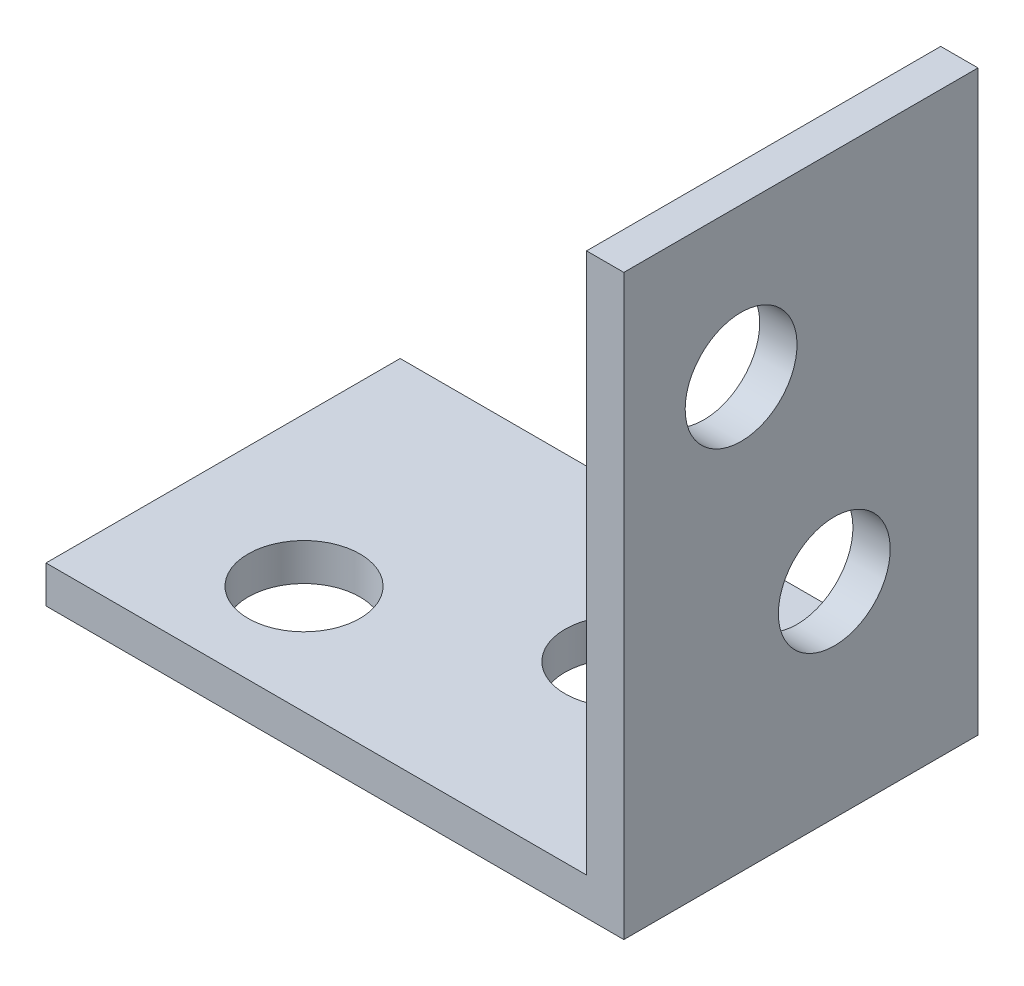
ISO-10303-21;
HEADER;
FILE_DESCRIPTION(('STEP AP214'),'2;1');
FILE_NAME('part.step','',(''),(''),'','','');
FILE_SCHEMA(('AUTOMOTIVE_DESIGN { 1 0 10303 214 1 1 1 1 }'));
ENDSEC;
DATA;
#1=APPLICATION_CONTEXT('core data for automotive mechanical design processes');
#2=APPLICATION_PROTOCOL_DEFINITION('international standard','automotive_design',2000,#1);
#3=PRODUCT_CONTEXT('',#1,'mechanical');
#4=PRODUCT('Part','Part','',(#3));
#5=PRODUCT_RELATED_PRODUCT_CATEGORY('part','',(#4));
#6=PRODUCT_DEFINITION_FORMATION('','',#4);
#7=PRODUCT_DEFINITION_CONTEXT('part definition',#1,'design');
#8=PRODUCT_DEFINITION('design','',#6,#7);
#9=PRODUCT_DEFINITION_SHAPE('','',#8);
#10=(LENGTH_UNIT() NAMED_UNIT(*) SI_UNIT(.MILLI.,.METRE.));
#11=(NAMED_UNIT(*) PLANE_ANGLE_UNIT() SI_UNIT($,.RADIAN.));
#12=(NAMED_UNIT(*) SI_UNIT($,.STERADIAN.) SOLID_ANGLE_UNIT());
#13=UNCERTAINTY_MEASURE_WITH_UNIT(LENGTH_MEASURE(1.E-05),#10,'distance_accuracy_value','');
#14=(GEOMETRIC_REPRESENTATION_CONTEXT(3) GLOBAL_UNCERTAINTY_ASSIGNED_CONTEXT((#13)) GLOBAL_UNIT_ASSIGNED_CONTEXT((#10,
#11,#12)) REPRESENTATION_CONTEXT('',''));
#15=CARTESIAN_POINT('',(0.,0.,0.));
#16=DIRECTION('',(0.,0.,1.));
#17=DIRECTION('',(1.,0.,0.));
#18=AXIS2_PLACEMENT_3D('',#15,#16,#17);
#19=CARTESIAN_POINT('',(0.,2.,19.));
#20=DIRECTION('',(1.,0.,0.));
#21=DIRECTION('',(0.,1.,0.));
#22=AXIS2_PLACEMENT_3D('',#19,#20,#21);
#23=PLANE('',#22);
#24=DIRECTION('',(0.,-1.,0.));
#25=VECTOR('',#24,1.);
#26=CARTESIAN_POINT('',(0.,2.,0.));
#27=LINE('',#26,#25);
#28=CARTESIAN_POINT('',(0.,2.,0.));
#29=VERTEX_POINT('',#28);
#30=CARTESIAN_POINT('',(0.,0.,0.));
#31=VERTEX_POINT('',#30);
#32=EDGE_CURVE('E125',#29,#31,#27,.T.);
#33=ORIENTED_EDGE('',*,*,#32,.T.);
#34=DIRECTION('',(0.,0.,-1.));
#35=VECTOR('',#34,1.);
#36=CARTESIAN_POINT('',(0.,0.,19.));
#37=LINE('',#36,#35);
#38=CARTESIAN_POINT('',(0.,0.,19.));
#39=VERTEX_POINT('',#38);
#40=EDGE_CURVE('E11',#39,#31,#37,.T.);
#41=ORIENTED_EDGE('',*,*,#40,.F.);
#42=DIRECTION('',(0.,-1.,0.));
#43=VECTOR('',#42,1.);
#44=CARTESIAN_POINT('',(0.,2.,19.));
#45=LINE('',#44,#43);
#46=CARTESIAN_POINT('',(0.,2.,19.));
#47=VERTEX_POINT('',#46);
#48=EDGE_CURVE('E136',#47,#39,#45,.T.);
#49=ORIENTED_EDGE('',*,*,#48,.F.);
#50=DIRECTION('',(0.,0.,-1.));
#51=VECTOR('',#50,1.);
#52=CARTESIAN_POINT('',(0.,2.,19.));
#53=LINE('',#52,#51);
#54=EDGE_CURVE('E121',#47,#29,#53,.T.);
#55=ORIENTED_EDGE('',*,*,#54,.T.);
#56=EDGE_LOOP('',(#33,#41,#49,#55));
#57=FACE_BOUND('',#56,.T.);
#58=ADVANCED_FACE('F41',(#57),#23,.F.);
#59=CARTESIAN_POINT('',(0.,0.,19.));
#60=DIRECTION('',(0.,1.,0.));
#61=DIRECTION('',(0.,0.,1.));
#62=AXIS2_PLACEMENT_3D('',#59,#60,#61);
#63=PLANE('',#62);
#64=CARTESIAN_POINT('',(20.,0.,8.15685710092901));
#65=DIRECTION('',(0.,1.,0.));
#66=DIRECTION('',(0.,0.,1.));
#67=AXIS2_PLACEMENT_3D('',#64,#65,#66);
#68=CIRCLE('',#67,3.);
#69=CARTESIAN_POINT('',(20.,0.,11.156857100929));
#70=VERTEX_POINT('',#69);
#71=EDGE_CURVE('E247',#70,#70,#68,.T.);
#72=ORIENTED_EDGE('',*,*,#71,.T.);
#73=EDGE_LOOP('',(#72));
#74=FACE_BOUND('',#73,.T.);
#75=CARTESIAN_POINT('',(8.,0.,13.156857100929));
#76=DIRECTION('',(0.,1.,0.));
#77=DIRECTION('',(0.,0.,1.));
#78=AXIS2_PLACEMENT_3D('',#75,#76,#77);
#79=CIRCLE('',#78,3.);
#80=CARTESIAN_POINT('',(8.,0.,16.156857100929));
#81=VERTEX_POINT('',#80);
#82=EDGE_CURVE('E249',#81,#81,#79,.T.);
#83=ORIENTED_EDGE('',*,*,#82,.T.);
#84=EDGE_LOOP('',(#83));
#85=FACE_BOUND('',#84,.T.);
#86=DIRECTION('',(1.,0.,0.));
#87=VECTOR('',#86,1.);
#88=CARTESIAN_POINT('',(0.,0.,0.));
#89=LINE('',#88,#87);
#90=CARTESIAN_POINT('',(31.,0.,0.));
#91=VERTEX_POINT('',#90);
#92=EDGE_CURVE('E128',#31,#91,#89,.T.);
#93=ORIENTED_EDGE('',*,*,#92,.T.);
#94=DIRECTION('',(0.,0.,-1.));
#95=VECTOR('',#94,1.);
#96=CARTESIAN_POINT('',(31.,0.,19.));
#97=LINE('',#96,#95);
#98=CARTESIAN_POINT('',(31.,0.,19.));
#99=VERTEX_POINT('',#98);
#100=EDGE_CURVE('E49',#99,#91,#97,.T.);
#101=ORIENTED_EDGE('',*,*,#100,.F.);
#102=DIRECTION('',(1.,0.,0.));
#103=VECTOR('',#102,1.);
#104=CARTESIAN_POINT('',(0.,0.,19.));
#105=LINE('',#104,#103);
#106=EDGE_CURVE('E94',#39,#99,#105,.T.);
#107=ORIENTED_EDGE('',*,*,#106,.F.);
#108=ORIENTED_EDGE('',*,*,#40,.T.);
#109=EDGE_LOOP('',(#93,#101,#107,#108));
#110=FACE_BOUND('',#109,.T.);
#111=ADVANCED_FACE('F166',(#74,#85,#110),#63,.F.);
#112=CARTESIAN_POINT('',(31.,0.,19.));
#113=DIRECTION('',(-1.,0.,0.));
#114=DIRECTION('',(0.,0.,1.));
#115=AXIS2_PLACEMENT_3D('',#112,#113,#114);
#116=PLANE('',#115);
#117=CARTESIAN_POINT('',(31.,11.,7.7098383528405));
#118=DIRECTION('',(-1.,0.,0.));
#119=DIRECTION('',(0.,0.,1.));
#120=AXIS2_PLACEMENT_3D('',#117,#118,#119);
#121=CIRCLE('',#120,3.);
#122=CARTESIAN_POINT('',(31.,11.,10.7098383528405));
#123=VERTEX_POINT('',#122);
#124=EDGE_CURVE('E129',#123,#123,#121,.T.);
#125=ORIENTED_EDGE('',*,*,#124,.T.);
#126=EDGE_LOOP('',(#125));
#127=FACE_BOUND('',#126,.T.);
#128=CARTESIAN_POINT('',(31.,23.,12.7098383528405));
#129=DIRECTION('',(-1.,0.,0.));
#130=DIRECTION('',(0.,0.,1.));
#131=AXIS2_PLACEMENT_3D('',#128,#129,#130);
#132=CIRCLE('',#131,3.);
#133=CARTESIAN_POINT('',(31.,23.,15.7098383528405));
#134=VERTEX_POINT('',#133);
#135=EDGE_CURVE('E259',#134,#134,#132,.T.);
#136=ORIENTED_EDGE('',*,*,#135,.T.);
#137=EDGE_LOOP('',(#136));
#138=FACE_BOUND('',#137,.T.);
#139=DIRECTION('',(0.,1.,0.));
#140=VECTOR('',#139,1.);
#141=CARTESIAN_POINT('',(31.,0.,0.));
#142=LINE('',#141,#140);
#143=CARTESIAN_POINT('',(31.,31.,0.));
#144=VERTEX_POINT('',#143);
#145=EDGE_CURVE('E131',#91,#144,#142,.T.);
#146=ORIENTED_EDGE('',*,*,#145,.T.);
#147=DIRECTION('',(0.,0.,-1.));
#148=VECTOR('',#147,1.);
#149=CARTESIAN_POINT('',(31.,31.,19.));
#150=LINE('',#149,#148);
#151=CARTESIAN_POINT('',(31.,31.,19.));
#152=VERTEX_POINT('',#151);
#153=EDGE_CURVE('E116',#152,#144,#150,.T.);
#154=ORIENTED_EDGE('',*,*,#153,.F.);
#155=DIRECTION('',(0.,1.,0.));
#156=VECTOR('',#155,1.);
#157=CARTESIAN_POINT('',(31.,0.,19.));
#158=LINE('',#157,#156);
#159=EDGE_CURVE('E107',#99,#152,#158,.T.);
#160=ORIENTED_EDGE('',*,*,#159,.F.);
#161=ORIENTED_EDGE('',*,*,#100,.T.);
#162=EDGE_LOOP('',(#146,#154,#160,#161));
#163=FACE_BOUND('',#162,.T.);
#164=ADVANCED_FACE('F142',(#127,#138,#163),#116,.F.);
#165=CARTESIAN_POINT('',(31.,31.,19.));
#166=DIRECTION('',(0.,-1.,0.));
#167=DIRECTION('',(0.,0.,-1.));
#168=AXIS2_PLACEMENT_3D('',#165,#166,#167);
#169=PLANE('',#168);
#170=DIRECTION('',(-1.,0.,0.));
#171=VECTOR('',#170,1.);
#172=CARTESIAN_POINT('',(31.,31.,0.));
#173=LINE('',#172,#171);
#174=CARTESIAN_POINT('',(29.,31.,0.));
#175=VERTEX_POINT('',#174);
#176=EDGE_CURVE('E115',#144,#175,#173,.T.);
#177=ORIENTED_EDGE('',*,*,#176,.T.);
#178=DIRECTION('',(0.,0.,-1.));
#179=VECTOR('',#178,1.);
#180=CARTESIAN_POINT('',(29.,31.,19.));
#181=LINE('',#180,#179);
#182=CARTESIAN_POINT('',(29.,31.,19.));
#183=VERTEX_POINT('',#182);
#184=EDGE_CURVE('E112',#183,#175,#181,.T.);
#185=ORIENTED_EDGE('',*,*,#184,.F.);
#186=DIRECTION('',(-1.,0.,0.));
#187=VECTOR('',#186,1.);
#188=CARTESIAN_POINT('',(31.,31.,19.));
#189=LINE('',#188,#187);
#190=EDGE_CURVE('E101',#152,#183,#189,.T.);
#191=ORIENTED_EDGE('',*,*,#190,.F.);
#192=ORIENTED_EDGE('',*,*,#153,.T.);
#193=EDGE_LOOP('',(#177,#185,#191,#192));
#194=FACE_BOUND('',#193,.T.);
#195=ADVANCED_FACE('F113',(#194),#169,.F.);
#196=CARTESIAN_POINT('',(29.,31.,19.));
#197=DIRECTION('',(1.,0.,0.));
#198=DIRECTION('',(0.,1.,0.));
#199=AXIS2_PLACEMENT_3D('',#196,#197,#198);
#200=PLANE('',#199);
#201=CARTESIAN_POINT('',(29.,11.,7.7098383528405));
#202=DIRECTION('',(-1.,0.,0.));
#203=DIRECTION('',(0.,-1.,0.));
#204=AXIS2_PLACEMENT_3D('',#201,#202,#203);
#205=CIRCLE('',#204,3.);
#206=CARTESIAN_POINT('',(29.,8.,7.7098383528405));
#207=VERTEX_POINT('',#206);
#208=EDGE_CURVE('E252',#207,#207,#205,.T.);
#209=ORIENTED_EDGE('',*,*,#208,.F.);
#210=EDGE_LOOP('',(#209));
#211=FACE_BOUND('',#210,.T.);
#212=CARTESIAN_POINT('',(29.,23.,12.7098383528405));
#213=DIRECTION('',(-1.,0.,0.));
#214=DIRECTION('',(0.,-1.,0.));
#215=AXIS2_PLACEMENT_3D('',#212,#213,#214);
#216=CIRCLE('',#215,3.);
#217=CARTESIAN_POINT('',(29.,20.,12.7098383528405));
#218=VERTEX_POINT('',#217);
#219=EDGE_CURVE('E248',#218,#218,#216,.T.);
#220=ORIENTED_EDGE('',*,*,#219,.F.);
#221=EDGE_LOOP('',(#220));
#222=FACE_BOUND('',#221,.T.);
#223=DIRECTION('',(0.,-1.,0.));
#224=VECTOR('',#223,1.);
#225=CARTESIAN_POINT('',(29.,31.,0.));
#226=LINE('',#225,#224);
#227=CARTESIAN_POINT('',(29.,2.,0.));
#228=VERTEX_POINT('',#227);
#229=EDGE_CURVE('E80',#175,#228,#226,.T.);
#230=ORIENTED_EDGE('',*,*,#229,.T.);
#231=DIRECTION('',(0.,0.,-1.));
#232=VECTOR('',#231,1.);
#233=CARTESIAN_POINT('',(29.,2.,19.));
#234=LINE('',#233,#232);
#235=CARTESIAN_POINT('',(29.,2.,19.));
#236=VERTEX_POINT('',#235);
#237=EDGE_CURVE('E117',#236,#228,#234,.T.);
#238=ORIENTED_EDGE('',*,*,#237,.F.);
#239=DIRECTION('',(0.,-1.,0.));
#240=VECTOR('',#239,1.);
#241=CARTESIAN_POINT('',(29.,31.,19.));
#242=LINE('',#241,#240);
#243=EDGE_CURVE('E105',#183,#236,#242,.T.);
#244=ORIENTED_EDGE('',*,*,#243,.F.);
#245=ORIENTED_EDGE('',*,*,#184,.T.);
#246=EDGE_LOOP('',(#230,#238,#244,#245));
#247=FACE_BOUND('',#246,.T.);
#248=ADVANCED_FACE('F119',(#211,#222,#247),#200,.F.);
#249=CARTESIAN_POINT('',(29.,2.,19.));
#250=DIRECTION('',(0.,-1.,0.));
#251=DIRECTION('',(1.,0.,0.));
#252=AXIS2_PLACEMENT_3D('',#249,#250,#251);
#253=PLANE('',#252);
#254=CARTESIAN_POINT('',(20.,2.,8.15685710092901));
#255=DIRECTION('',(0.,1.,0.));
#256=DIRECTION('',(-1.,0.,0.));
#257=AXIS2_PLACEMENT_3D('',#254,#255,#256);
#258=CIRCLE('',#257,3.);
#259=CARTESIAN_POINT('',(17.,2.,8.15685710092901));
#260=VERTEX_POINT('',#259);
#261=EDGE_CURVE('E245',#260,#260,#258,.T.);
#262=ORIENTED_EDGE('',*,*,#261,.F.);
#263=EDGE_LOOP('',(#262));
#264=FACE_BOUND('',#263,.T.);
#265=CARTESIAN_POINT('',(8.,2.,13.156857100929));
#266=DIRECTION('',(0.,1.,0.));
#267=DIRECTION('',(-1.,0.,0.));
#268=AXIS2_PLACEMENT_3D('',#265,#266,#267);
#269=CIRCLE('',#268,3.);
#270=CARTESIAN_POINT('',(5.,2.,13.156857100929));
#271=VERTEX_POINT('',#270);
#272=EDGE_CURVE('E274',#271,#271,#269,.T.);
#273=ORIENTED_EDGE('',*,*,#272,.F.);
#274=EDGE_LOOP('',(#273));
#275=FACE_BOUND('',#274,.T.);
#276=DIRECTION('',(-1.,0.,0.));
#277=VECTOR('',#276,1.);
#278=CARTESIAN_POINT('',(29.,2.,0.));
#279=LINE('',#278,#277);
#280=EDGE_CURVE('E86',#228,#29,#279,.T.);
#281=ORIENTED_EDGE('',*,*,#280,.T.);
#282=ORIENTED_EDGE('',*,*,#54,.F.);
#283=DIRECTION('',(-1.,0.,0.));
#284=VECTOR('',#283,1.);
#285=CARTESIAN_POINT('',(29.,2.,19.));
#286=LINE('',#285,#284);
#287=EDGE_CURVE('E57',#236,#47,#286,.T.);
#288=ORIENTED_EDGE('',*,*,#287,.F.);
#289=ORIENTED_EDGE('',*,*,#237,.T.);
#290=EDGE_LOOP('',(#281,#282,#288,#289));
#291=FACE_BOUND('',#290,.T.);
#292=ADVANCED_FACE('F149',(#264,#275,#291),#253,.F.);
#293=CARTESIAN_POINT('',(0.,0.,19.));
#294=DIRECTION('',(0.,0.,1.));
#295=DIRECTION('',(1.,0.,0.));
#296=AXIS2_PLACEMENT_3D('',#293,#294,#295);
#297=PLANE('',#296);
#298=ORIENTED_EDGE('',*,*,#48,.T.);
#299=ORIENTED_EDGE('',*,*,#106,.T.);
#300=ORIENTED_EDGE('',*,*,#159,.T.);
#301=ORIENTED_EDGE('',*,*,#190,.T.);
#302=ORIENTED_EDGE('',*,*,#243,.T.);
#303=ORIENTED_EDGE('',*,*,#287,.T.);
#304=EDGE_LOOP('',(#298,#299,#300,#301,#302,#303));
#305=FACE_BOUND('',#304,.T.);
#306=ADVANCED_FACE('F103',(#305),#297,.T.);
#307=CARTESIAN_POINT('',(0.,0.,0.));
#308=DIRECTION('',(0.,0.,1.));
#309=DIRECTION('',(1.,0.,0.));
#310=AXIS2_PLACEMENT_3D('',#307,#308,#309);
#311=PLANE('',#310);
#312=ORIENTED_EDGE('',*,*,#32,.F.);
#313=ORIENTED_EDGE('',*,*,#280,.F.);
#314=ORIENTED_EDGE('',*,*,#229,.F.);
#315=ORIENTED_EDGE('',*,*,#176,.F.);
#316=ORIENTED_EDGE('',*,*,#145,.F.);
#317=ORIENTED_EDGE('',*,*,#92,.F.);
#318=EDGE_LOOP('',(#312,#313,#314,#315,#316,#317));
#319=FACE_BOUND('',#318,.T.);
#320=ADVANCED_FACE('F145',(#319),#311,.F.);
#321=CARTESIAN_POINT('',(48.,23.,12.7098383528405));
#322=DIRECTION('',(-1.,0.,0.));
#323=DIRECTION('',(0.,-1.,0.));
#324=AXIS2_PLACEMENT_3D('',#321,#322,#323);
#325=CYLINDRICAL_SURFACE('',#324,3.);
#326=ORIENTED_EDGE('',*,*,#219,.T.);
#327=EDGE_LOOP('',(#326));
#328=FACE_BOUND('',#327,.T.);
#329=ORIENTED_EDGE('',*,*,#135,.F.);
#330=EDGE_LOOP('',(#329));
#331=FACE_BOUND('',#330,.T.);
#332=ADVANCED_FACE('F195',(#328,#331),#325,.F.);
#333=CARTESIAN_POINT('',(48.,11.,7.7098383528405));
#334=DIRECTION('',(-1.,0.,0.));
#335=DIRECTION('',(0.,-1.,0.));
#336=AXIS2_PLACEMENT_3D('',#333,#334,#335);
#337=CYLINDRICAL_SURFACE('',#336,3.);
#338=ORIENTED_EDGE('',*,*,#208,.T.);
#339=EDGE_LOOP('',(#338));
#340=FACE_BOUND('',#339,.T.);
#341=ORIENTED_EDGE('',*,*,#124,.F.);
#342=EDGE_LOOP('',(#341));
#343=FACE_BOUND('',#342,.T.);
#344=ADVANCED_FACE('F210',(#340,#343),#337,.F.);
#345=CARTESIAN_POINT('',(8.,-17.,13.156857100929));
#346=DIRECTION('',(0.,1.,0.));
#347=DIRECTION('',(-1.,0.,0.));
#348=AXIS2_PLACEMENT_3D('',#345,#346,#347);
#349=CYLINDRICAL_SURFACE('',#348,3.);
#350=ORIENTED_EDGE('',*,*,#272,.T.);
#351=EDGE_LOOP('',(#350));
#352=FACE_BOUND('',#351,.T.);
#353=ORIENTED_EDGE('',*,*,#82,.F.);
#354=EDGE_LOOP('',(#353));
#355=FACE_BOUND('',#354,.T.);
#356=ADVANCED_FACE('F218',(#352,#355),#349,.F.);
#357=CARTESIAN_POINT('',(20.,-17.,8.15685710092901));
#358=DIRECTION('',(0.,1.,0.));
#359=DIRECTION('',(-1.,0.,0.));
#360=AXIS2_PLACEMENT_3D('',#357,#358,#359);
#361=CYLINDRICAL_SURFACE('',#360,3.);
#362=ORIENTED_EDGE('',*,*,#261,.T.);
#363=EDGE_LOOP('',(#362));
#364=FACE_BOUND('',#363,.T.);
#365=ORIENTED_EDGE('',*,*,#71,.F.);
#366=EDGE_LOOP('',(#365));
#367=FACE_BOUND('',#366,.T.);
#368=ADVANCED_FACE('F230',(#364,#367),#361,.F.);
#369=CLOSED_SHELL('',(#58,#111,#164,#195,#248,#292,#306,#320,#332,#344,#356,#368));
#370=MANIFOLD_SOLID_BREP('B2',#369);
#371=ADVANCED_BREP_SHAPE_REPRESENTATION('',(#18,#370),#14);
#372=SHAPE_DEFINITION_REPRESENTATION(#9,#371);
ENDSEC;
END-ISO-10303-21;
